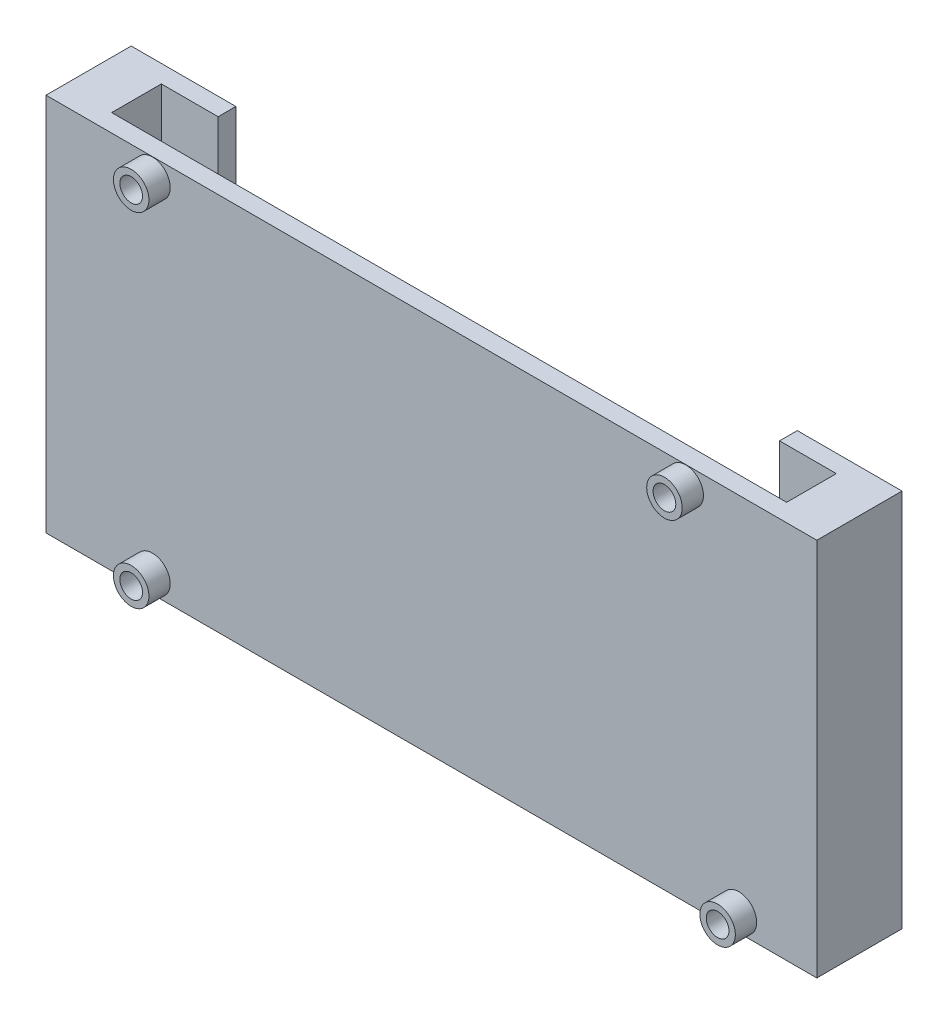
ISO-10303-21;
HEADER;
FILE_DESCRIPTION(('STEP AP214'),'2;1');
FILE_NAME('part.step','',(''),(''),'','','');
FILE_SCHEMA(('AUTOMOTIVE_DESIGN { 1 0 10303 214 1 1 1 1 }'));
ENDSEC;
DATA;
#1=APPLICATION_CONTEXT('core data for automotive mechanical design processes');
#2=APPLICATION_PROTOCOL_DEFINITION('international standard','automotive_design',2000,#1);
#3=PRODUCT_CONTEXT('',#1,'mechanical');
#4=PRODUCT('Part','Part','',(#3));
#5=PRODUCT_RELATED_PRODUCT_CATEGORY('part','',(#4));
#6=PRODUCT_DEFINITION_FORMATION('','',#4);
#7=PRODUCT_DEFINITION_CONTEXT('part definition',#1,'design');
#8=PRODUCT_DEFINITION('design','',#6,#7);
#9=PRODUCT_DEFINITION_SHAPE('','',#8);
#10=(LENGTH_UNIT() NAMED_UNIT(*) SI_UNIT(.MILLI.,.METRE.));
#11=(NAMED_UNIT(*) PLANE_ANGLE_UNIT() SI_UNIT($,.RADIAN.));
#12=(NAMED_UNIT(*) SI_UNIT($,.STERADIAN.) SOLID_ANGLE_UNIT());
#13=UNCERTAINTY_MEASURE_WITH_UNIT(LENGTH_MEASURE(1.E-05),#10,'distance_accuracy_value','');
#14=(GEOMETRIC_REPRESENTATION_CONTEXT(3) GLOBAL_UNCERTAINTY_ASSIGNED_CONTEXT((#13)) GLOBAL_UNIT_ASSIGNED_CONTEXT((#10,
#11,#12)) REPRESENTATION_CONTEXT('',''));
#15=CARTESIAN_POINT('',(0.,0.,0.));
#16=DIRECTION('',(0.,0.,1.));
#17=DIRECTION('',(1.,0.,0.));
#18=AXIS2_PLACEMENT_3D('',#15,#16,#17);
#19=CARTESIAN_POINT('',(-47.55,26.7081,-9.5));
#20=DIRECTION('',(-1.,0.,0.));
#21=DIRECTION('',(0.,-1.,0.));
#22=AXIS2_PLACEMENT_3D('',#19,#20,#21);
#23=PLANE('',#22);
#24=DIRECTION('',(0.,-1.,0.));
#25=VECTOR('',#24,1.);
#26=CARTESIAN_POINT('',(-47.55,26.7081,-7.));
#27=LINE('',#26,#25);
#28=CARTESIAN_POINT('',(-47.55,26.7081,-7.));
#29=VERTEX_POINT('',#28);
#30=CARTESIAN_POINT('',(-47.55,-26.7081,-7.00000000000001));
#31=VERTEX_POINT('',#30);
#32=EDGE_CURVE('E158',#29,#31,#27,.T.);
#33=ORIENTED_EDGE('',*,*,#32,.F.);
#34=DIRECTION('',(0.,0.,1.));
#35=VECTOR('',#34,1.);
#36=CARTESIAN_POINT('',(-47.55,26.7081,-9.5));
#37=LINE('',#36,#35);
#38=CARTESIAN_POINT('',(-47.55,26.7081,0.));
#39=VERTEX_POINT('',#38);
#40=EDGE_CURVE('E186',#29,#39,#37,.T.);
#41=ORIENTED_EDGE('',*,*,#40,.T.);
#42=DIRECTION('',(0.,-1.,0.));
#43=VECTOR('',#42,1.);
#44=CARTESIAN_POINT('',(-47.55,26.7081,0.));
#45=LINE('',#44,#43);
#46=CARTESIAN_POINT('',(-47.55,-26.7081,0.));
#47=VERTEX_POINT('',#46);
#48=EDGE_CURVE('E192',#39,#47,#45,.T.);
#49=ORIENTED_EDGE('',*,*,#48,.T.);
#50=DIRECTION('',(0.,0.,1.));
#51=VECTOR('',#50,1.);
#52=CARTESIAN_POINT('',(-47.55,-26.7081,-9.5));
#53=LINE('',#52,#51);
#54=EDGE_CURVE('E57',#31,#47,#53,.T.);
#55=ORIENTED_EDGE('',*,*,#54,.F.);
#56=EDGE_LOOP('',(#33,#41,#49,#55));
#57=FACE_BOUND('',#56,.T.);
#58=ADVANCED_FACE('F41',(#57),#23,.F.);
#59=CARTESIAN_POINT('',(47.55,26.7081,-9.5));
#60=DIRECTION('',(1.,0.,0.));
#61=DIRECTION('',(0.,1.,0.));
#62=AXIS2_PLACEMENT_3D('',#59,#60,#61);
#63=PLANE('',#62);
#64=DIRECTION('',(0.,1.,0.));
#65=VECTOR('',#64,1.);
#66=CARTESIAN_POINT('',(47.55,26.7081,-7.));
#67=LINE('',#66,#65);
#68=CARTESIAN_POINT('',(47.55,-26.7081,-6.99999999999999));
#69=VERTEX_POINT('',#68);
#70=CARTESIAN_POINT('',(47.55,26.7081,-7.));
#71=VERTEX_POINT('',#70);
#72=EDGE_CURVE('E175',#69,#71,#67,.T.);
#73=ORIENTED_EDGE('',*,*,#72,.F.);
#74=DIRECTION('',(0.,0.,1.));
#75=VECTOR('',#74,1.);
#76=CARTESIAN_POINT('',(47.55,-26.7081,-9.5));
#77=LINE('',#76,#75);
#78=CARTESIAN_POINT('',(47.55,-26.7081,0.));
#79=VERTEX_POINT('',#78);
#80=EDGE_CURVE('E63',#69,#79,#77,.T.);
#81=ORIENTED_EDGE('',*,*,#80,.T.);
#82=DIRECTION('',(0.,1.,0.));
#83=VECTOR('',#82,1.);
#84=CARTESIAN_POINT('',(47.55,26.7081,0.));
#85=LINE('',#84,#83);
#86=CARTESIAN_POINT('',(47.55,26.7081,0.));
#87=VERTEX_POINT('',#86);
#88=EDGE_CURVE('E193',#79,#87,#85,.T.);
#89=ORIENTED_EDGE('',*,*,#88,.T.);
#90=DIRECTION('',(0.,0.,1.));
#91=VECTOR('',#90,1.);
#92=CARTESIAN_POINT('',(47.55,26.7081,-9.5));
#93=LINE('',#92,#91);
#94=EDGE_CURVE('E202',#71,#87,#93,.T.);
#95=ORIENTED_EDGE('',*,*,#94,.F.);
#96=EDGE_LOOP('',(#73,#81,#89,#95));
#97=FACE_BOUND('',#96,.T.);
#98=ADVANCED_FACE('F308',(#97),#63,.F.);
#99=CARTESIAN_POINT('',(0.,0.,0.));
#100=DIRECTION('',(0.,0.,-1.));
#101=DIRECTION('',(-1.,0.,0.));
#102=AXIS2_PLACEMENT_3D('',#99,#100,#101);
#103=PLANE('',#102);
#104=CARTESIAN_POINT('',(-39.3,24.1681,0.));
#105=DIRECTION('',(0.,0.,1.));
#106=DIRECTION('',(1.,0.,0.));
#107=AXIS2_PLACEMENT_3D('',#104,#105,#106);
#108=CIRCLE('',#107,1.6);
#109=CARTESIAN_POINT('',(-37.7,24.1681,0.));
#110=VERTEX_POINT('',#109);
#111=EDGE_CURVE('E212',#110,#110,#108,.T.);
#112=ORIENTED_EDGE('',*,*,#111,.T.);
#113=EDGE_LOOP('',(#112));
#114=FACE_BOUND('',#113,.T.);
#115=CARTESIAN_POINT('',(35.83,24.1681,0.));
#116=DIRECTION('',(0.,0.,1.));
#117=DIRECTION('',(1.,0.,0.));
#118=AXIS2_PLACEMENT_3D('',#115,#116,#117);
#119=CIRCLE('',#118,1.6);
#120=CARTESIAN_POINT('',(37.43,24.1681,0.));
#121=VERTEX_POINT('',#120);
#122=EDGE_CURVE('E219',#121,#121,#119,.T.);
#123=ORIENTED_EDGE('',*,*,#122,.T.);
#124=EDGE_LOOP('',(#123));
#125=FACE_BOUND('',#124,.T.);
#126=CARTESIAN_POINT('',(43.32,-24.16810902,0.));
#127=DIRECTION('',(0.,0.,1.));
#128=DIRECTION('',(1.,0.,0.));
#129=AXIS2_PLACEMENT_3D('',#126,#127,#128);
#130=CIRCLE('',#129,1.6);
#131=CARTESIAN_POINT('',(44.92,-24.16810902,0.));
#132=VERTEX_POINT('',#131);
#133=EDGE_CURVE('E223',#132,#132,#130,.T.);
#134=ORIENTED_EDGE('',*,*,#133,.T.);
#135=EDGE_LOOP('',(#134));
#136=FACE_BOUND('',#135,.T.);
#137=CARTESIAN_POINT('',(-39.3,-24.16810902,0.));
#138=DIRECTION('',(0.,0.,1.));
#139=DIRECTION('',(1.,0.,0.));
#140=AXIS2_PLACEMENT_3D('',#137,#138,#139);
#141=CIRCLE('',#140,1.6);
#142=CARTESIAN_POINT('',(-37.7,-24.16810902,0.));
#143=VERTEX_POINT('',#142);
#144=EDGE_CURVE('E229',#143,#143,#141,.T.);
#145=ORIENTED_EDGE('',*,*,#144,.T.);
#146=EDGE_LOOP('',(#145));
#147=FACE_BOUND('',#146,.T.);
#148=DIRECTION('',(1.,0.,0.));
#149=VECTOR('',#148,1.);
#150=CARTESIAN_POINT('',(-54.3,-26.7081,0.));
#151=LINE('',#150,#149);
#152=EDGE_CURVE('E249',#47,#79,#151,.T.);
#153=ORIENTED_EDGE('',*,*,#152,.F.);
#154=ORIENTED_EDGE('',*,*,#48,.F.);
#155=DIRECTION('',(-1.,0.,0.));
#156=VECTOR('',#155,1.);
#157=CARTESIAN_POINT('',(-54.3,26.7081,0.));
#158=LINE('',#157,#156);
#159=EDGE_CURVE('E244',#87,#39,#158,.T.);
#160=ORIENTED_EDGE('',*,*,#159,.F.);
#161=ORIENTED_EDGE('',*,*,#88,.F.);
#162=EDGE_LOOP('',(#153,#154,#160,#161));
#163=FACE_BOUND('',#162,.T.);
#164=ADVANCED_FACE('F315',(#114,#125,#136,#147,#163),#103,.T.);
#165=CARTESIAN_POINT('',(54.3,-26.7081,2.5));
#166=DIRECTION('',(-1.,0.,0.));
#167=DIRECTION('',(0.,0.,1.));
#168=AXIS2_PLACEMENT_3D('',#165,#166,#167);
#169=PLANE('',#168);
#170=DIRECTION('',(0.,0.,-1.));
#171=VECTOR('',#170,1.);
#172=CARTESIAN_POINT('',(54.3,-26.7081,2.5));
#173=LINE('',#172,#171);
#174=CARTESIAN_POINT('',(54.3,-26.7081,2.5));
#175=VERTEX_POINT('',#174);
#176=CARTESIAN_POINT('',(54.3,-26.7081,-9.5));
#177=VERTEX_POINT('',#176);
#178=EDGE_CURVE('E256',#175,#177,#173,.T.);
#179=ORIENTED_EDGE('',*,*,#178,.T.);
#180=DIRECTION('',(0.,-1.,0.));
#181=VECTOR('',#180,1.);
#182=CARTESIAN_POINT('',(54.3,26.7081,-9.5));
#183=LINE('',#182,#181);
#184=CARTESIAN_POINT('',(54.3,26.7081,-9.5));
#185=VERTEX_POINT('',#184);
#186=EDGE_CURVE('E200',#185,#177,#183,.T.);
#187=ORIENTED_EDGE('',*,*,#186,.F.);
#188=DIRECTION('',(0.,0.,-1.));
#189=VECTOR('',#188,1.);
#190=CARTESIAN_POINT('',(54.3,26.7081,2.5));
#191=LINE('',#190,#189);
#192=CARTESIAN_POINT('',(54.3,26.7081,2.5));
#193=VERTEX_POINT('',#192);
#194=EDGE_CURVE('E263',#193,#185,#191,.T.);
#195=ORIENTED_EDGE('',*,*,#194,.F.);
#196=DIRECTION('',(0.,1.,0.));
#197=VECTOR('',#196,1.);
#198=CARTESIAN_POINT('',(54.3,-26.7081,2.5));
#199=LINE('',#198,#197);
#200=EDGE_CURVE('E246',#175,#193,#199,.T.);
#201=ORIENTED_EDGE('',*,*,#200,.F.);
#202=EDGE_LOOP('',(#179,#187,#195,#201));
#203=FACE_BOUND('',#202,.T.);
#204=ADVANCED_FACE('F43',(#203),#169,.F.);
#205=CARTESIAN_POINT('',(-54.3,26.7081,2.5));
#206=DIRECTION('',(0.,-1.,0.));
#207=DIRECTION('',(0.,0.,-1.));
#208=AXIS2_PLACEMENT_3D('',#205,#206,#207);
#209=PLANE('',#208);
#210=ORIENTED_EDGE('',*,*,#194,.T.);
#211=DIRECTION('',(1.,0.,0.));
#212=VECTOR('',#211,1.);
#213=CARTESIAN_POINT('',(54.3,26.7081,-9.5));
#214=LINE('',#213,#212);
#215=CARTESIAN_POINT('',(39.55,26.7081,-9.5));
#216=VERTEX_POINT('',#215);
#217=EDGE_CURVE('E201',#216,#185,#214,.T.);
#218=ORIENTED_EDGE('',*,*,#217,.F.);
#219=DIRECTION('',(0.,0.,-1.));
#220=VECTOR('',#219,1.);
#221=CARTESIAN_POINT('',(39.55,26.7081,-9.5));
#222=LINE('',#221,#220);
#223=CARTESIAN_POINT('',(39.55,26.7081,-7.));
#224=VERTEX_POINT('',#223);
#225=EDGE_CURVE('E179',#224,#216,#222,.T.);
#226=ORIENTED_EDGE('',*,*,#225,.F.);
#227=DIRECTION('',(1.,0.,0.));
#228=VECTOR('',#227,1.);
#229=CARTESIAN_POINT('',(39.55,26.7081,-7.));
#230=LINE('',#229,#228);
#231=EDGE_CURVE('E182',#224,#71,#230,.T.);
#232=ORIENTED_EDGE('',*,*,#231,.T.);
#233=ORIENTED_EDGE('',*,*,#94,.T.);
#234=ORIENTED_EDGE('',*,*,#159,.T.);
#235=ORIENTED_EDGE('',*,*,#40,.F.);
#236=DIRECTION('',(-1.,0.,0.));
#237=VECTOR('',#236,1.);
#238=CARTESIAN_POINT('',(-39.55,26.7081,-7.));
#239=LINE('',#238,#237);
#240=CARTESIAN_POINT('',(-39.55,26.7081,-7.));
#241=VERTEX_POINT('',#240);
#242=EDGE_CURVE('E150',#241,#29,#239,.T.);
#243=ORIENTED_EDGE('',*,*,#242,.F.);
#244=DIRECTION('',(0.,0.,1.));
#245=VECTOR('',#244,1.);
#246=CARTESIAN_POINT('',(-39.55,26.7081,-9.5));
#247=LINE('',#246,#245);
#248=CARTESIAN_POINT('',(-39.55,26.7081,-9.5));
#249=VERTEX_POINT('',#248);
#250=EDGE_CURVE('E147',#249,#241,#247,.T.);
#251=ORIENTED_EDGE('',*,*,#250,.F.);
#252=DIRECTION('',(1.,0.,0.));
#253=VECTOR('',#252,1.);
#254=CARTESIAN_POINT('',(-54.3,26.7081,-9.5));
#255=LINE('',#254,#253);
#256=CARTESIAN_POINT('',(-54.3,26.7081,-9.5));
#257=VERTEX_POINT('',#256);
#258=EDGE_CURVE('E131',#257,#249,#255,.T.);
#259=ORIENTED_EDGE('',*,*,#258,.F.);
#260=DIRECTION('',(0.,0.,-1.));
#261=VECTOR('',#260,1.);
#262=CARTESIAN_POINT('',(-54.3,26.7081,2.5));
#263=LINE('',#262,#261);
#264=CARTESIAN_POINT('',(-54.3,26.7081,2.5));
#265=VERTEX_POINT('',#264);
#266=EDGE_CURVE('E264',#265,#257,#263,.T.);
#267=ORIENTED_EDGE('',*,*,#266,.F.);
#268=DIRECTION('',(-1.,0.,0.));
#269=VECTOR('',#268,1.);
#270=CARTESIAN_POINT('',(-54.3,26.7081,2.5));
#271=LINE('',#270,#269);
#272=EDGE_CURVE('E248',#193,#265,#271,.T.);
#273=ORIENTED_EDGE('',*,*,#272,.F.);
#274=EDGE_LOOP('',(#210,#218,#226,#232,#233,#234,#235,#243,#251,#259,#267,#273));
#275=FACE_BOUND('',#274,.T.);
#276=ADVANCED_FACE('F149',(#275),#209,.F.);
#277=CARTESIAN_POINT('',(-54.3,-26.7081,2.5));
#278=DIRECTION('',(1.,0.,0.));
#279=DIRECTION('',(0.,0.,-1.));
#280=AXIS2_PLACEMENT_3D('',#277,#278,#279);
#281=PLANE('',#280);
#282=ORIENTED_EDGE('',*,*,#266,.T.);
#283=DIRECTION('',(0.,1.,0.));
#284=VECTOR('',#283,1.);
#285=CARTESIAN_POINT('',(-54.3,26.7081,-9.5));
#286=LINE('',#285,#284);
#287=CARTESIAN_POINT('',(-54.3,-26.7081,-9.5));
#288=VERTEX_POINT('',#287);
#289=EDGE_CURVE('E142',#288,#257,#286,.T.);
#290=ORIENTED_EDGE('',*,*,#289,.F.);
#291=DIRECTION('',(0.,0.,-1.));
#292=VECTOR('',#291,1.);
#293=CARTESIAN_POINT('',(-54.3,-26.7081,2.5));
#294=LINE('',#293,#292);
#295=CARTESIAN_POINT('',(-54.3,-26.7081,2.5));
#296=VERTEX_POINT('',#295);
#297=EDGE_CURVE('E262',#296,#288,#294,.T.);
#298=ORIENTED_EDGE('',*,*,#297,.F.);
#299=DIRECTION('',(0.,-1.,0.));
#300=VECTOR('',#299,1.);
#301=CARTESIAN_POINT('',(-54.3,-26.7081,2.5));
#302=LINE('',#301,#300);
#303=EDGE_CURVE('E255',#265,#296,#302,.T.);
#304=ORIENTED_EDGE('',*,*,#303,.F.);
#305=EDGE_LOOP('',(#282,#290,#298,#304));
#306=FACE_BOUND('',#305,.T.);
#307=ADVANCED_FACE('F321',(#306),#281,.F.);
#308=CARTESIAN_POINT('',(-54.3,-26.7081,2.5));
#309=DIRECTION('',(0.,1.,0.));
#310=DIRECTION('',(0.,0.,1.));
#311=AXIS2_PLACEMENT_3D('',#308,#309,#310);
#312=PLANE('',#311);
#313=CARTESIAN_POINT('',(-50.925,-26.7081,-3.5));
#314=DIRECTION('',(0.,-1.,0.));
#315=DIRECTION('',(0.,0.,-1.));
#316=AXIS2_PLACEMENT_3D('',#313,#314,#315);
#317=CIRCLE('',#316,3.15);
#318=CARTESIAN_POINT('',(-50.925,-26.7081,-6.65));
#319=VERTEX_POINT('',#318);
#320=EDGE_CURVE('E518',#319,#319,#317,.T.);
#321=ORIENTED_EDGE('',*,*,#320,.F.);
#322=EDGE_LOOP('',(#321));
#323=FACE_BOUND('',#322,.T.);
#324=CARTESIAN_POINT('',(50.925,-26.7081,-3.5));
#325=DIRECTION('',(0.,-1.,0.));
#326=DIRECTION('',(0.,0.,-1.));
#327=AXIS2_PLACEMENT_3D('',#324,#325,#326);
#328=CIRCLE('',#327,3.15);
#329=CARTESIAN_POINT('',(50.925,-26.7081,-6.65));
#330=VERTEX_POINT('',#329);
#331=EDGE_CURVE('E525',#330,#330,#328,.T.);
#332=ORIENTED_EDGE('',*,*,#331,.F.);
#333=EDGE_LOOP('',(#332));
#334=FACE_BOUND('',#333,.T.);
#335=ORIENTED_EDGE('',*,*,#297,.T.);
#336=DIRECTION('',(-1.,0.,0.));
#337=VECTOR('',#336,1.);
#338=CARTESIAN_POINT('',(-54.3,-26.7081,-9.5));
#339=LINE('',#338,#337);
#340=CARTESIAN_POINT('',(-39.55,-26.7081,-9.50000000000001));
#341=VERTEX_POINT('',#340);
#342=EDGE_CURVE('E144',#341,#288,#339,.T.);
#343=ORIENTED_EDGE('',*,*,#342,.F.);
#344=DIRECTION('',(0.,0.,-1.));
#345=VECTOR('',#344,1.);
#346=CARTESIAN_POINT('',(-39.55,-26.7081,-9.50000000000001));
#347=LINE('',#346,#345);
#348=CARTESIAN_POINT('',(-39.55,-26.7081,-7.00000000000001));
#349=VERTEX_POINT('',#348);
#350=EDGE_CURVE('E160',#349,#341,#347,.T.);
#351=ORIENTED_EDGE('',*,*,#350,.F.);
#352=DIRECTION('',(-1.,0.,0.));
#353=VECTOR('',#352,1.);
#354=CARTESIAN_POINT('',(-39.55,-26.7081,-7.00000000000001));
#355=LINE('',#354,#353);
#356=EDGE_CURVE('E166',#349,#31,#355,.T.);
#357=ORIENTED_EDGE('',*,*,#356,.T.);
#358=ORIENTED_EDGE('',*,*,#54,.T.);
#359=ORIENTED_EDGE('',*,*,#152,.T.);
#360=ORIENTED_EDGE('',*,*,#80,.F.);
#361=DIRECTION('',(1.,0.,0.));
#362=VECTOR('',#361,1.);
#363=CARTESIAN_POINT('',(39.55,-26.7081,-6.99999999999999));
#364=LINE('',#363,#362);
#365=CARTESIAN_POINT('',(39.55,-26.7081,-6.99999999999999));
#366=VERTEX_POINT('',#365);
#367=EDGE_CURVE('E190',#366,#69,#364,.T.);
#368=ORIENTED_EDGE('',*,*,#367,.F.);
#369=DIRECTION('',(0.,0.,1.));
#370=VECTOR('',#369,1.);
#371=CARTESIAN_POINT('',(39.55,-26.7081,-9.49999999999999));
#372=LINE('',#371,#370);
#373=CARTESIAN_POINT('',(39.55,-26.7081,-9.49999999999999));
#374=VERTEX_POINT('',#373);
#375=EDGE_CURVE('E176',#374,#366,#372,.T.);
#376=ORIENTED_EDGE('',*,*,#375,.F.);
#377=DIRECTION('',(-1.,0.,0.));
#378=VECTOR('',#377,1.);
#379=CARTESIAN_POINT('',(54.3,-26.7081,-9.5));
#380=LINE('',#379,#378);
#381=EDGE_CURVE('E198',#177,#374,#380,.T.);
#382=ORIENTED_EDGE('',*,*,#381,.F.);
#383=ORIENTED_EDGE('',*,*,#178,.F.);
#384=DIRECTION('',(1.,0.,0.));
#385=VECTOR('',#384,1.);
#386=CARTESIAN_POINT('',(-54.3,-26.7081,2.5));
#387=LINE('',#386,#385);
#388=EDGE_CURVE('E251',#296,#175,#387,.T.);
#389=ORIENTED_EDGE('',*,*,#388,.F.);
#390=EDGE_LOOP('',(#335,#343,#351,#357,#358,#359,#360,#368,#376,#382,#383,#389));
#391=FACE_BOUND('',#390,.T.);
#392=ADVANCED_FACE('F282',(#323,#334,#391),#312,.F.);
#393=CARTESIAN_POINT('',(0.,0.,2.5));
#394=DIRECTION('',(0.,0.,-1.));
#395=DIRECTION('',(-1.,0.,0.));
#396=AXIS2_PLACEMENT_3D('',#393,#394,#395);
#397=PLANE('',#396);
#398=CARTESIAN_POINT('',(-39.3,-24.16810902,2.5));
#399=DIRECTION('',(0.,0.,-1.));
#400=DIRECTION('',(-1.,0.,0.));
#401=AXIS2_PLACEMENT_3D('',#398,#399,#400);
#402=CIRCLE('',#401,2.5);
#403=CARTESIAN_POINT('',(-41.8,-24.16810902,2.5));
#404=VERTEX_POINT('',#403);
#405=EDGE_CURVE('E11',#404,#404,#402,.F.);
#406=ORIENTED_EDGE('',*,*,#405,.F.);
#407=EDGE_LOOP('',(#406));
#408=FACE_BOUND('',#407,.T.);
#409=CARTESIAN_POINT('',(43.32,-24.16810902,2.5));
#410=DIRECTION('',(0.,0.,-1.));
#411=DIRECTION('',(-1.,0.,0.));
#412=AXIS2_PLACEMENT_3D('',#409,#410,#411);
#413=CIRCLE('',#412,2.5);
#414=CARTESIAN_POINT('',(40.82,-24.16810902,2.5));
#415=VERTEX_POINT('',#414);
#416=EDGE_CURVE('E47',#415,#415,#413,.F.);
#417=ORIENTED_EDGE('',*,*,#416,.F.);
#418=EDGE_LOOP('',(#417));
#419=FACE_BOUND('',#418,.T.);
#420=CARTESIAN_POINT('',(35.83,24.1681,2.5));
#421=DIRECTION('',(0.,0.,-1.));
#422=DIRECTION('',(-1.,0.,0.));
#423=AXIS2_PLACEMENT_3D('',#420,#421,#422);
#424=CIRCLE('',#423,2.5);
#425=CARTESIAN_POINT('',(33.33,24.1681,2.5));
#426=VERTEX_POINT('',#425);
#427=EDGE_CURVE('E267',#426,#426,#424,.F.);
#428=ORIENTED_EDGE('',*,*,#427,.F.);
#429=EDGE_LOOP('',(#428));
#430=FACE_BOUND('',#429,.T.);
#431=CARTESIAN_POINT('',(-39.3,24.1681,2.5));
#432=DIRECTION('',(0.,0.,-1.));
#433=DIRECTION('',(-1.,0.,0.));
#434=AXIS2_PLACEMENT_3D('',#431,#432,#433);
#435=CIRCLE('',#434,2.5);
#436=CARTESIAN_POINT('',(-41.8,24.1681,2.5));
#437=VERTEX_POINT('',#436);
#438=EDGE_CURVE('E266',#437,#437,#435,.F.);
#439=ORIENTED_EDGE('',*,*,#438,.F.);
#440=EDGE_LOOP('',(#439));
#441=FACE_BOUND('',#440,.T.);
#442=ORIENTED_EDGE('',*,*,#200,.T.);
#443=ORIENTED_EDGE('',*,*,#272,.T.);
#444=ORIENTED_EDGE('',*,*,#303,.T.);
#445=ORIENTED_EDGE('',*,*,#388,.T.);
#446=EDGE_LOOP('',(#442,#443,#444,#445));
#447=FACE_BOUND('',#446,.T.);
#448=ADVANCED_FACE('F277',(#408,#419,#430,#441,#447),#397,.F.);
#449=CARTESIAN_POINT('',(-39.3,24.1681,5.5));
#450=DIRECTION('',(0.,0.,-1.));
#451=DIRECTION('',(-1.,0.,0.));
#452=AXIS2_PLACEMENT_3D('',#449,#450,#451);
#453=CYLINDRICAL_SURFACE('',#452,2.5);
#454=CARTESIAN_POINT('',(-39.3,24.1681,5.5));
#455=DIRECTION('',(0.,0.,1.));
#456=DIRECTION('',(1.,0.,0.));
#457=AXIS2_PLACEMENT_3D('',#454,#455,#456);
#458=CIRCLE('',#457,2.5);
#459=CARTESIAN_POINT('',(-36.8,24.1681,5.5));
#460=VERTEX_POINT('',#459);
#461=EDGE_CURVE('E245',#460,#460,#458,.T.);
#462=ORIENTED_EDGE('',*,*,#461,.F.);
#463=EDGE_LOOP('',(#462));
#464=FACE_BOUND('',#463,.T.);
#465=ORIENTED_EDGE('',*,*,#438,.T.);
#466=EDGE_LOOP('',(#465));
#467=FACE_BOUND('',#466,.T.);
#468=ADVANCED_FACE('F280',(#464,#467),#453,.T.);
#469=CARTESIAN_POINT('',(-39.3,24.1681,5.5));
#470=DIRECTION('',(0.,0.,1.));
#471=DIRECTION('',(1.,0.,0.));
#472=AXIS2_PLACEMENT_3D('',#469,#470,#471);
#473=PLANE('',#472);
#474=CARTESIAN_POINT('',(-39.3,24.1681,5.5));
#475=DIRECTION('',(0.,0.,1.));
#476=DIRECTION('',(1.,0.,0.));
#477=AXIS2_PLACEMENT_3D('',#474,#475,#476);
#478=CIRCLE('',#477,1.6);
#479=CARTESIAN_POINT('',(-37.7,24.1681,5.5));
#480=VERTEX_POINT('',#479);
#481=EDGE_CURVE('E209',#480,#480,#478,.T.);
#482=ORIENTED_EDGE('',*,*,#481,.F.);
#483=EDGE_LOOP('',(#482));
#484=FACE_BOUND('',#483,.T.);
#485=ORIENTED_EDGE('',*,*,#461,.T.);
#486=EDGE_LOOP('',(#485));
#487=FACE_BOUND('',#486,.T.);
#488=ADVANCED_FACE('F380',(#484,#487),#473,.T.);
#489=CARTESIAN_POINT('',(35.83,24.1681,5.5));
#490=DIRECTION('',(0.,0.,-1.));
#491=DIRECTION('',(-1.,0.,0.));
#492=AXIS2_PLACEMENT_3D('',#489,#490,#491);
#493=CYLINDRICAL_SURFACE('',#492,2.5);
#494=CARTESIAN_POINT('',(35.83,24.1681,5.5));
#495=DIRECTION('',(0.,0.,1.));
#496=DIRECTION('',(1.,0.,0.));
#497=AXIS2_PLACEMENT_3D('',#494,#495,#496);
#498=CIRCLE('',#497,2.5);
#499=CARTESIAN_POINT('',(38.33,24.1681,5.5));
#500=VERTEX_POINT('',#499);
#501=EDGE_CURVE('E237',#500,#500,#498,.T.);
#502=ORIENTED_EDGE('',*,*,#501,.F.);
#503=EDGE_LOOP('',(#502));
#504=FACE_BOUND('',#503,.T.);
#505=ORIENTED_EDGE('',*,*,#427,.T.);
#506=EDGE_LOOP('',(#505));
#507=FACE_BOUND('',#506,.T.);
#508=ADVANCED_FACE('F372',(#504,#507),#493,.T.);
#509=CARTESIAN_POINT('',(35.83,24.1681,5.5));
#510=DIRECTION('',(0.,0.,1.));
#511=DIRECTION('',(1.,0.,0.));
#512=AXIS2_PLACEMENT_3D('',#509,#510,#511);
#513=PLANE('',#512);
#514=CARTESIAN_POINT('',(35.83,24.1681,5.5));
#515=DIRECTION('',(0.,0.,1.));
#516=DIRECTION('',(1.,0.,0.));
#517=AXIS2_PLACEMENT_3D('',#514,#515,#516);
#518=CIRCLE('',#517,1.6);
#519=CARTESIAN_POINT('',(37.43,24.1681,5.5));
#520=VERTEX_POINT('',#519);
#521=EDGE_CURVE('E215',#520,#520,#518,.T.);
#522=ORIENTED_EDGE('',*,*,#521,.F.);
#523=EDGE_LOOP('',(#522));
#524=FACE_BOUND('',#523,.T.);
#525=ORIENTED_EDGE('',*,*,#501,.T.);
#526=EDGE_LOOP('',(#525));
#527=FACE_BOUND('',#526,.T.);
#528=ADVANCED_FACE('F367',(#524,#527),#513,.T.);
#529=CARTESIAN_POINT('',(43.32,-24.16810902,5.5));
#530=DIRECTION('',(0.,0.,-1.));
#531=DIRECTION('',(-1.,0.,0.));
#532=AXIS2_PLACEMENT_3D('',#529,#530,#531);
#533=CYLINDRICAL_SURFACE('',#532,2.5);
#534=CARTESIAN_POINT('',(43.32,-24.16810902,5.5));
#535=DIRECTION('',(0.,0.,1.));
#536=DIRECTION('',(1.,0.,0.));
#537=AXIS2_PLACEMENT_3D('',#534,#535,#536);
#538=CIRCLE('',#537,2.5);
#539=CARTESIAN_POINT('',(45.82,-24.16810902,5.5));
#540=VERTEX_POINT('',#539);
#541=EDGE_CURVE('E236',#540,#540,#538,.T.);
#542=ORIENTED_EDGE('',*,*,#541,.F.);
#543=EDGE_LOOP('',(#542));
#544=FACE_BOUND('',#543,.T.);
#545=ORIENTED_EDGE('',*,*,#416,.T.);
#546=EDGE_LOOP('',(#545));
#547=FACE_BOUND('',#546,.T.);
#548=ADVANCED_FACE('F273',(#544,#547),#533,.T.);
#549=CARTESIAN_POINT('',(43.32,-24.16810902,5.5));
#550=DIRECTION('',(0.,0.,1.));
#551=DIRECTION('',(1.,0.,0.));
#552=AXIS2_PLACEMENT_3D('',#549,#550,#551);
#553=PLANE('',#552);
#554=CARTESIAN_POINT('',(43.32,-24.16810902,5.5));
#555=DIRECTION('',(0.,0.,1.));
#556=DIRECTION('',(1.,0.,0.));
#557=AXIS2_PLACEMENT_3D('',#554,#555,#556);
#558=CIRCLE('',#557,1.6);
#559=CARTESIAN_POINT('',(44.92,-24.16810902,5.5));
#560=VERTEX_POINT('',#559);
#561=EDGE_CURVE('E224',#560,#560,#558,.T.);
#562=ORIENTED_EDGE('',*,*,#561,.F.);
#563=EDGE_LOOP('',(#562));
#564=FACE_BOUND('',#563,.T.);
#565=ORIENTED_EDGE('',*,*,#541,.T.);
#566=EDGE_LOOP('',(#565));
#567=FACE_BOUND('',#566,.T.);
#568=ADVANCED_FACE('F365',(#564,#567),#553,.T.);
#569=CARTESIAN_POINT('',(-39.3,-24.16810902,5.5));
#570=DIRECTION('',(0.,0.,-1.));
#571=DIRECTION('',(-1.,0.,0.));
#572=AXIS2_PLACEMENT_3D('',#569,#570,#571);
#573=CYLINDRICAL_SURFACE('',#572,2.5);
#574=CARTESIAN_POINT('',(-39.3,-24.16810902,5.5));
#575=DIRECTION('',(0.,0.,1.));
#576=DIRECTION('',(1.,0.,0.));
#577=AXIS2_PLACEMENT_3D('',#574,#575,#576);
#578=CIRCLE('',#577,2.5);
#579=CARTESIAN_POINT('',(-36.8,-24.16810902,5.5));
#580=VERTEX_POINT('',#579);
#581=EDGE_CURVE('E231',#580,#580,#578,.T.);
#582=ORIENTED_EDGE('',*,*,#581,.F.);
#583=EDGE_LOOP('',(#582));
#584=FACE_BOUND('',#583,.T.);
#585=ORIENTED_EDGE('',*,*,#405,.T.);
#586=EDGE_LOOP('',(#585));
#587=FACE_BOUND('',#586,.T.);
#588=ADVANCED_FACE('F360',(#584,#587),#573,.T.);
#589=CARTESIAN_POINT('',(-39.3,-24.16810902,5.5));
#590=DIRECTION('',(0.,0.,1.));
#591=DIRECTION('',(1.,0.,0.));
#592=AXIS2_PLACEMENT_3D('',#589,#590,#591);
#593=PLANE('',#592);
#594=CARTESIAN_POINT('',(-39.3,-24.16810902,5.5));
#595=DIRECTION('',(0.,0.,1.));
#596=DIRECTION('',(1.,0.,0.));
#597=AXIS2_PLACEMENT_3D('',#594,#595,#596);
#598=CIRCLE('',#597,1.6);
#599=CARTESIAN_POINT('',(-37.7,-24.16810902,5.5));
#600=VERTEX_POINT('',#599);
#601=EDGE_CURVE('E227',#600,#600,#598,.T.);
#602=ORIENTED_EDGE('',*,*,#601,.F.);
#603=EDGE_LOOP('',(#602));
#604=FACE_BOUND('',#603,.T.);
#605=ORIENTED_EDGE('',*,*,#581,.T.);
#606=EDGE_LOOP('',(#605));
#607=FACE_BOUND('',#606,.T.);
#608=ADVANCED_FACE('F357',(#604,#607),#593,.T.);
#609=CARTESIAN_POINT('',(-39.3,-24.16810902,5.5));
#610=DIRECTION('',(0.,0.,1.));
#611=DIRECTION('',(1.,0.,0.));
#612=AXIS2_PLACEMENT_3D('',#609,#610,#611);
#613=CYLINDRICAL_SURFACE('',#612,1.6);
#614=ORIENTED_EDGE('',*,*,#144,.F.);
#615=EDGE_LOOP('',(#614));
#616=FACE_BOUND('',#615,.T.);
#617=ORIENTED_EDGE('',*,*,#601,.T.);
#618=EDGE_LOOP('',(#617));
#619=FACE_BOUND('',#618,.T.);
#620=ADVANCED_FACE('F355',(#616,#619),#613,.F.);
#621=CARTESIAN_POINT('',(43.32,-24.16810902,5.5));
#622=DIRECTION('',(0.,0.,1.));
#623=DIRECTION('',(1.,0.,0.));
#624=AXIS2_PLACEMENT_3D('',#621,#622,#623);
#625=CYLINDRICAL_SURFACE('',#624,1.6);
#626=ORIENTED_EDGE('',*,*,#133,.F.);
#627=EDGE_LOOP('',(#626));
#628=FACE_BOUND('',#627,.T.);
#629=ORIENTED_EDGE('',*,*,#561,.T.);
#630=EDGE_LOOP('',(#629));
#631=FACE_BOUND('',#630,.T.);
#632=ADVANCED_FACE('F346',(#628,#631),#625,.F.);
#633=CARTESIAN_POINT('',(35.83,24.1681,5.5));
#634=DIRECTION('',(0.,0.,1.));
#635=DIRECTION('',(1.,0.,0.));
#636=AXIS2_PLACEMENT_3D('',#633,#634,#635);
#637=CYLINDRICAL_SURFACE('',#636,1.6);
#638=ORIENTED_EDGE('',*,*,#122,.F.);
#639=EDGE_LOOP('',(#638));
#640=FACE_BOUND('',#639,.T.);
#641=ORIENTED_EDGE('',*,*,#521,.T.);
#642=EDGE_LOOP('',(#641));
#643=FACE_BOUND('',#642,.T.);
#644=ADVANCED_FACE('F345',(#640,#643),#637,.F.);
#645=CARTESIAN_POINT('',(-39.3,24.1681,5.5));
#646=DIRECTION('',(0.,0.,1.));
#647=DIRECTION('',(1.,0.,0.));
#648=AXIS2_PLACEMENT_3D('',#645,#646,#647);
#649=CYLINDRICAL_SURFACE('',#648,1.6);
#650=ORIENTED_EDGE('',*,*,#111,.F.);
#651=EDGE_LOOP('',(#650));
#652=FACE_BOUND('',#651,.T.);
#653=ORIENTED_EDGE('',*,*,#481,.T.);
#654=EDGE_LOOP('',(#653));
#655=FACE_BOUND('',#654,.T.);
#656=ADVANCED_FACE('F341',(#652,#655),#649,.F.);
#657=CARTESIAN_POINT('',(0.,0.,-9.5));
#658=DIRECTION('',(0.,0.,-1.));
#659=DIRECTION('',(-1.,0.,0.));
#660=AXIS2_PLACEMENT_3D('',#657,#658,#659);
#661=PLANE('',#660);
#662=ORIENTED_EDGE('',*,*,#186,.T.);
#663=ORIENTED_EDGE('',*,*,#381,.T.);
#664=DIRECTION('',(0.,-1.,0.));
#665=VECTOR('',#664,1.);
#666=CARTESIAN_POINT('',(39.55,26.7081,-9.5));
#667=LINE('',#666,#665);
#668=EDGE_CURVE('E173',#216,#374,#667,.T.);
#669=ORIENTED_EDGE('',*,*,#668,.F.);
#670=ORIENTED_EDGE('',*,*,#217,.T.);
#671=EDGE_LOOP('',(#662,#663,#669,#670));
#672=FACE_BOUND('',#671,.T.);
#673=ADVANCED_FACE('F300',(#672),#661,.T.);
#674=CARTESIAN_POINT('',(0.,0.,-9.5));
#675=DIRECTION('',(0.,0.,1.));
#676=DIRECTION('',(1.,0.,0.));
#677=AXIS2_PLACEMENT_3D('',#674,#675,#676);
#678=PLANE('',#677);
#679=ORIENTED_EDGE('',*,*,#289,.T.);
#680=ORIENTED_EDGE('',*,*,#258,.T.);
#681=DIRECTION('',(0.,1.,0.));
#682=VECTOR('',#681,1.);
#683=CARTESIAN_POINT('',(-39.55,26.7081,-9.5));
#684=LINE('',#683,#682);
#685=EDGE_CURVE('E138',#341,#249,#684,.T.);
#686=ORIENTED_EDGE('',*,*,#685,.F.);
#687=ORIENTED_EDGE('',*,*,#342,.T.);
#688=EDGE_LOOP('',(#679,#680,#686,#687));
#689=FACE_BOUND('',#688,.T.);
#690=ADVANCED_FACE('F139',(#689),#678,.F.);
#691=CARTESIAN_POINT('',(39.55,26.7081,-7.));
#692=DIRECTION('',(0.,0.,-1.));
#693=DIRECTION('',(0.,1.,0.));
#694=AXIS2_PLACEMENT_3D('',#691,#692,#693);
#695=PLANE('',#694);
#696=ORIENTED_EDGE('',*,*,#72,.T.);
#697=ORIENTED_EDGE('',*,*,#231,.F.);
#698=DIRECTION('',(0.,1.,0.));
#699=VECTOR('',#698,1.);
#700=CARTESIAN_POINT('',(39.55,26.7081,-7.));
#701=LINE('',#700,#699);
#702=EDGE_CURVE('E178',#366,#224,#701,.T.);
#703=ORIENTED_EDGE('',*,*,#702,.F.);
#704=ORIENTED_EDGE('',*,*,#367,.T.);
#705=EDGE_LOOP('',(#696,#697,#703,#704));
#706=FACE_BOUND('',#705,.T.);
#707=ADVANCED_FACE('F324',(#706),#695,.F.);
#708=CARTESIAN_POINT('',(39.55,0.,0.));
#709=DIRECTION('',(-1.,0.,0.));
#710=DIRECTION('',(0.,-1.,0.));
#711=AXIS2_PLACEMENT_3D('',#708,#709,#710);
#712=PLANE('',#711);
#713=ORIENTED_EDGE('',*,*,#668,.T.);
#714=ORIENTED_EDGE('',*,*,#375,.T.);
#715=ORIENTED_EDGE('',*,*,#702,.T.);
#716=ORIENTED_EDGE('',*,*,#225,.T.);
#717=EDGE_LOOP('',(#713,#714,#715,#716));
#718=FACE_BOUND('',#717,.T.);
#719=ADVANCED_FACE('F301',(#718),#712,.T.);
#720=CARTESIAN_POINT('',(-39.55,26.7081,-7.));
#721=DIRECTION('',(0.,0.,-1.));
#722=DIRECTION('',(0.,1.,0.));
#723=AXIS2_PLACEMENT_3D('',#720,#721,#722);
#724=PLANE('',#723);
#725=ORIENTED_EDGE('',*,*,#32,.T.);
#726=ORIENTED_EDGE('',*,*,#356,.F.);
#727=DIRECTION('',(0.,-1.,0.));
#728=VECTOR('',#727,1.);
#729=CARTESIAN_POINT('',(-39.55,26.7081,-7.));
#730=LINE('',#729,#728);
#731=EDGE_CURVE('E154',#241,#349,#730,.T.);
#732=ORIENTED_EDGE('',*,*,#731,.F.);
#733=ORIENTED_EDGE('',*,*,#242,.T.);
#734=EDGE_LOOP('',(#725,#726,#732,#733));
#735=FACE_BOUND('',#734,.T.);
#736=ADVANCED_FACE('F319',(#735),#724,.F.);
#737=CARTESIAN_POINT('',(-39.55,0.,0.));
#738=DIRECTION('',(-1.,0.,0.));
#739=DIRECTION('',(0.,-1.,0.));
#740=AXIS2_PLACEMENT_3D('',#737,#738,#739);
#741=PLANE('',#740);
#742=ORIENTED_EDGE('',*,*,#685,.T.);
#743=ORIENTED_EDGE('',*,*,#250,.T.);
#744=ORIENTED_EDGE('',*,*,#731,.T.);
#745=ORIENTED_EDGE('',*,*,#350,.T.);
#746=EDGE_LOOP('',(#742,#743,#744,#745));
#747=FACE_BOUND('',#746,.T.);
#748=ADVANCED_FACE('F159',(#747),#741,.F.);
#749=CARTESIAN_POINT('',(50.925,-24.0081,-3.5));
#750=DIRECTION('',(0.,-1.,0.));
#751=DIRECTION('',(0.,0.,-1.));
#752=AXIS2_PLACEMENT_3D('',#749,#750,#751);
#753=CYLINDRICAL_SURFACE('',#752,3.15);
#754=CARTESIAN_POINT('',(50.925,-24.0081,-3.5));
#755=DIRECTION('',(0.,-1.,0.));
#756=DIRECTION('',(0.,0.,-1.));
#757=AXIS2_PLACEMENT_3D('',#754,#755,#756);
#758=CIRCLE('',#757,3.15);
#759=CARTESIAN_POINT('',(50.925,-24.0081,-6.65));
#760=VERTEX_POINT('',#759);
#761=EDGE_CURVE('E165',#760,#760,#758,.T.);
#762=CARTESIAN_POINT('',(50.925,-24.0081,-6.65));
#763=CARTESIAN_POINT('',(50.925,-24.036225,-6.65));
#764=CARTESIAN_POINT('',(50.925,-24.06435,-6.65));
#765=CARTESIAN_POINT('',(50.925,-24.1206,-6.65));
#766=CARTESIAN_POINT('',(50.925,-24.148725,-6.65));
#767=CARTESIAN_POINT('',(50.925,-24.204975,-6.65));
#768=CARTESIAN_POINT('',(50.925,-24.2331,-6.65));
#769=CARTESIAN_POINT('',(50.925,-24.28935,-6.65));
#770=CARTESIAN_POINT('',(50.925,-24.317475,-6.65));
#771=CARTESIAN_POINT('',(50.925,-24.373725,-6.65));
#772=CARTESIAN_POINT('',(50.925,-24.40185,-6.65));
#773=CARTESIAN_POINT('',(50.925,-24.4581,-6.65));
#774=CARTESIAN_POINT('',(50.925,-24.486225,-6.65));
#775=CARTESIAN_POINT('',(50.925,-24.542475,-6.65));
#776=CARTESIAN_POINT('',(50.925,-24.5706,-6.65));
#777=CARTESIAN_POINT('',(50.925,-24.62685,-6.65));
#778=CARTESIAN_POINT('',(50.925,-24.654975,-6.65));
#779=CARTESIAN_POINT('',(50.925,-24.711225,-6.65));
#780=CARTESIAN_POINT('',(50.925,-24.73935,-6.65));
#781=CARTESIAN_POINT('',(50.925,-24.7956,-6.65));
#782=CARTESIAN_POINT('',(50.925,-24.823725,-6.65));
#783=CARTESIAN_POINT('',(50.925,-24.879975,-6.65));
#784=CARTESIAN_POINT('',(50.925,-24.9081,-6.65));
#785=CARTESIAN_POINT('',(50.925,-24.96435,-6.65));
#786=CARTESIAN_POINT('',(50.925,-24.992475,-6.65));
#787=CARTESIAN_POINT('',(50.925,-25.048725,-6.65));
#788=CARTESIAN_POINT('',(50.925,-25.07685,-6.65));
#789=CARTESIAN_POINT('',(50.925,-25.1331,-6.65));
#790=CARTESIAN_POINT('',(50.925,-25.161225,-6.65));
#791=CARTESIAN_POINT('',(50.925,-25.217475,-6.65));
#792=CARTESIAN_POINT('',(50.925,-25.2456,-6.65));
#793=CARTESIAN_POINT('',(50.925,-25.30185,-6.65));
#794=CARTESIAN_POINT('',(50.925,-25.329975,-6.65));
#795=CARTESIAN_POINT('',(50.925,-25.386225,-6.65));
#796=CARTESIAN_POINT('',(50.925,-25.41435,-6.65));
#797=CARTESIAN_POINT('',(50.925,-25.4706,-6.65));
#798=CARTESIAN_POINT('',(50.925,-25.498725,-6.65));
#799=CARTESIAN_POINT('',(50.925,-25.554975,-6.65));
#800=CARTESIAN_POINT('',(50.925,-25.5831,-6.65));
#801=CARTESIAN_POINT('',(50.925,-25.63935,-6.65));
#802=CARTESIAN_POINT('',(50.925,-25.667475,-6.65));
#803=CARTESIAN_POINT('',(50.925,-25.723725,-6.65));
#804=CARTESIAN_POINT('',(50.925,-25.75185,-6.65));
#805=CARTESIAN_POINT('',(50.925,-25.8081,-6.65));
#806=CARTESIAN_POINT('',(50.925,-25.836225,-6.65));
#807=CARTESIAN_POINT('',(50.925,-25.892475,-6.65));
#808=CARTESIAN_POINT('',(50.925,-25.9206,-6.65));
#809=CARTESIAN_POINT('',(50.925,-25.97685,-6.65));
#810=CARTESIAN_POINT('',(50.925,-26.004975,-6.65));
#811=CARTESIAN_POINT('',(50.925,-26.061225,-6.65));
#812=CARTESIAN_POINT('',(50.925,-26.08935,-6.65));
#813=CARTESIAN_POINT('',(50.925,-26.1456,-6.65));
#814=CARTESIAN_POINT('',(50.925,-26.173725,-6.65));
#815=CARTESIAN_POINT('',(50.925,-26.229975,-6.65));
#816=CARTESIAN_POINT('',(50.925,-26.2581,-6.65));
#817=CARTESIAN_POINT('',(50.925,-26.31435,-6.65));
#818=CARTESIAN_POINT('',(50.925,-26.342475,-6.65));
#819=CARTESIAN_POINT('',(50.925,-26.398725,-6.65));
#820=CARTESIAN_POINT('',(50.925,-26.42685,-6.65));
#821=CARTESIAN_POINT('',(50.925,-26.4831,-6.65));
#822=CARTESIAN_POINT('',(50.925,-26.511225,-6.65));
#823=CARTESIAN_POINT('',(50.925,-26.567475,-6.65));
#824=CARTESIAN_POINT('',(50.925,-26.5956,-6.65));
#825=CARTESIAN_POINT('',(50.925,-26.65185,-6.65));
#826=CARTESIAN_POINT('',(50.925,-26.679975,-6.65));
#827=CARTESIAN_POINT('',(50.925,-26.7081,-6.65));
#828=B_SPLINE_CURVE_WITH_KNOTS('',3,(#762,#763,#764,#765,#766,#767,#768,#769,#770,#771,#772,
#773,#774,#775,#776,#777,#778,#779,#780,#781,#782,#783,#784,#785,#786,#787,#788,#789,#790,#791,
#792,#793,#794,#795,#796,#797,#798,#799,#800,#801,#802,#803,#804,#805,#806,#807,#808,#809,#810,
#811,#812,#813,#814,#815,#816,#817,#818,#819,#820,#821,#822,#823,#824,#825,#826,#827),
.UNSPECIFIED.,.F.,.F.,(4,2,2,2,2,2,2,2,2,2,2,2,2,2,2,2,2,2,2,2,2,2,2,2,2,2,2,2,2,2,2,2,4),(0.,
0.0843749999999976,0.168749999999999,0.253125,0.337499999999998,0.421874999999999,0.50625,
0.590624999999997,0.674999999999998,0.759375,0.843749999999997,0.928124999999998,1.0125,
1.096875,1.18125,1.265625,1.35,1.434375,1.51875,1.603125,1.6875,1.771875,1.85625,1.940625,2.025,
2.109375,2.19375,2.278125,2.3625,2.446875,2.53125,2.615625,2.7),.UNSPECIFIED.);
#829=EDGE_CURVE('BSEAM477',#760,#330,#828,.T.);
#830=ORIENTED_EDGE('',*,*,#761,.F.);
#831=ORIENTED_EDGE('',*,*,#331,.T.);
#832=ORIENTED_EDGE('',*,*,#829,.T.);
#833=ORIENTED_EDGE('',*,*,#829,.F.);
#834=EDGE_LOOP('',(#830,#832,#831,#833));
#835=FACE_BOUND('',#834,.T.);
#836=ADVANCED_FACE('F477',(#835),#753,.F.);
#837=CARTESIAN_POINT('',(50.925,-24.0081,-3.5));
#838=DIRECTION('',(0.,-1.,0.));
#839=DIRECTION('',(0.,0.,-1.));
#840=AXIS2_PLACEMENT_3D('',#837,#838,#839);
#841=PLANE('',#840);
#842=ORIENTED_EDGE('',*,*,#761,.T.);
#843=EDGE_LOOP('',(#842));
#844=FACE_BOUND('',#843,.T.);
#845=ADVANCED_FACE('F483',(#844),#841,.T.);
#846=CARTESIAN_POINT('',(-50.925,-24.0081,-3.5));
#847=DIRECTION('',(0.,-1.,0.));
#848=DIRECTION('',(0.,0.,-1.));
#849=AXIS2_PLACEMENT_3D('',#846,#847,#848);
#850=CYLINDRICAL_SURFACE('',#849,3.15);
#851=CARTESIAN_POINT('',(-50.925,-24.0081,-3.5));
#852=DIRECTION('',(0.,-1.,0.));
#853=DIRECTION('',(0.,0.,-1.));
#854=AXIS2_PLACEMENT_3D('',#851,#852,#853);
#855=CIRCLE('',#854,3.15);
#856=CARTESIAN_POINT('',(-50.925,-24.0081,-6.65));
#857=VERTEX_POINT('',#856);
#858=EDGE_CURVE('E163',#857,#857,#855,.T.);
#859=CARTESIAN_POINT('',(-50.925,-24.0081,-6.65));
#860=CARTESIAN_POINT('',(-50.925,-24.036225,-6.65));
#861=CARTESIAN_POINT('',(-50.925,-24.06435,-6.65));
#862=CARTESIAN_POINT('',(-50.925,-24.1206,-6.65));
#863=CARTESIAN_POINT('',(-50.925,-24.148725,-6.65));
#864=CARTESIAN_POINT('',(-50.925,-24.204975,-6.65));
#865=CARTESIAN_POINT('',(-50.925,-24.2331,-6.65));
#866=CARTESIAN_POINT('',(-50.925,-24.28935,-6.65));
#867=CARTESIAN_POINT('',(-50.925,-24.317475,-6.65));
#868=CARTESIAN_POINT('',(-50.925,-24.373725,-6.65));
#869=CARTESIAN_POINT('',(-50.925,-24.40185,-6.65));
#870=CARTESIAN_POINT('',(-50.925,-24.4581,-6.65));
#871=CARTESIAN_POINT('',(-50.925,-24.486225,-6.65));
#872=CARTESIAN_POINT('',(-50.925,-24.542475,-6.65));
#873=CARTESIAN_POINT('',(-50.925,-24.5706,-6.65));
#874=CARTESIAN_POINT('',(-50.925,-24.62685,-6.65));
#875=CARTESIAN_POINT('',(-50.925,-24.654975,-6.65));
#876=CARTESIAN_POINT('',(-50.925,-24.711225,-6.65));
#877=CARTESIAN_POINT('',(-50.925,-24.73935,-6.65));
#878=CARTESIAN_POINT('',(-50.925,-24.7956,-6.65));
#879=CARTESIAN_POINT('',(-50.925,-24.823725,-6.65));
#880=CARTESIAN_POINT('',(-50.925,-24.879975,-6.65));
#881=CARTESIAN_POINT('',(-50.925,-24.9081,-6.65));
#882=CARTESIAN_POINT('',(-50.925,-24.96435,-6.65));
#883=CARTESIAN_POINT('',(-50.925,-24.992475,-6.65));
#884=CARTESIAN_POINT('',(-50.925,-25.048725,-6.65));
#885=CARTESIAN_POINT('',(-50.925,-25.07685,-6.65));
#886=CARTESIAN_POINT('',(-50.925,-25.1331,-6.65));
#887=CARTESIAN_POINT('',(-50.925,-25.161225,-6.65));
#888=CARTESIAN_POINT('',(-50.925,-25.217475,-6.65));
#889=CARTESIAN_POINT('',(-50.925,-25.2456,-6.65));
#890=CARTESIAN_POINT('',(-50.925,-25.30185,-6.65));
#891=CARTESIAN_POINT('',(-50.925,-25.329975,-6.65));
#892=CARTESIAN_POINT('',(-50.925,-25.386225,-6.65));
#893=CARTESIAN_POINT('',(-50.925,-25.41435,-6.65));
#894=CARTESIAN_POINT('',(-50.925,-25.4706,-6.65));
#895=CARTESIAN_POINT('',(-50.925,-25.498725,-6.65));
#896=CARTESIAN_POINT('',(-50.925,-25.554975,-6.65));
#897=CARTESIAN_POINT('',(-50.925,-25.5831,-6.65));
#898=CARTESIAN_POINT('',(-50.925,-25.63935,-6.65));
#899=CARTESIAN_POINT('',(-50.925,-25.667475,-6.65));
#900=CARTESIAN_POINT('',(-50.925,-25.723725,-6.65));
#901=CARTESIAN_POINT('',(-50.925,-25.75185,-6.65));
#902=CARTESIAN_POINT('',(-50.925,-25.8081,-6.65));
#903=CARTESIAN_POINT('',(-50.925,-25.836225,-6.65));
#904=CARTESIAN_POINT('',(-50.925,-25.892475,-6.65));
#905=CARTESIAN_POINT('',(-50.925,-25.9206,-6.65));
#906=CARTESIAN_POINT('',(-50.925,-25.97685,-6.65));
#907=CARTESIAN_POINT('',(-50.925,-26.004975,-6.65));
#908=CARTESIAN_POINT('',(-50.925,-26.061225,-6.65));
#909=CARTESIAN_POINT('',(-50.925,-26.08935,-6.65));
#910=CARTESIAN_POINT('',(-50.925,-26.1456,-6.65));
#911=CARTESIAN_POINT('',(-50.925,-26.173725,-6.65));
#912=CARTESIAN_POINT('',(-50.925,-26.229975,-6.65));
#913=CARTESIAN_POINT('',(-50.925,-26.2581,-6.65));
#914=CARTESIAN_POINT('',(-50.925,-26.31435,-6.65));
#915=CARTESIAN_POINT('',(-50.925,-26.342475,-6.65));
#916=CARTESIAN_POINT('',(-50.925,-26.398725,-6.65));
#917=CARTESIAN_POINT('',(-50.925,-26.42685,-6.65));
#918=CARTESIAN_POINT('',(-50.925,-26.4831,-6.65));
#919=CARTESIAN_POINT('',(-50.925,-26.511225,-6.65));
#920=CARTESIAN_POINT('',(-50.925,-26.567475,-6.65));
#921=CARTESIAN_POINT('',(-50.925,-26.5956,-6.65));
#922=CARTESIAN_POINT('',(-50.925,-26.65185,-6.65));
#923=CARTESIAN_POINT('',(-50.925,-26.679975,-6.65));
#924=CARTESIAN_POINT('',(-50.925,-26.7081,-6.65));
#925=B_SPLINE_CURVE_WITH_KNOTS('',3,(#859,#860,#861,#862,#863,#864,#865,#866,#867,#868,#869,
#870,#871,#872,#873,#874,#875,#876,#877,#878,#879,#880,#881,#882,#883,#884,#885,#886,#887,#888,
#889,#890,#891,#892,#893,#894,#895,#896,#897,#898,#899,#900,#901,#902,#903,#904,#905,#906,#907,
#908,#909,#910,#911,#912,#913,#914,#915,#916,#917,#918,#919,#920,#921,#922,#923,#924),
.UNSPECIFIED.,.F.,.F.,(4,2,2,2,2,2,2,2,2,2,2,2,2,2,2,2,2,2,2,2,2,2,2,2,2,2,2,2,2,2,2,2,4),(0.,
0.0843749999999976,0.168749999999999,0.253125,0.337499999999998,0.421874999999999,0.50625,
0.590624999999997,0.674999999999998,0.759375,0.843749999999997,0.928124999999998,1.0125,
1.096875,1.18125,1.265625,1.35,1.434375,1.51875,1.603125,1.6875,1.771875,1.85625,1.940625,2.025,
2.109375,2.19375,2.278125,2.3625,2.446875,2.53125,2.615625,2.7),.UNSPECIFIED.);
#926=EDGE_CURVE('BSEAM494',#857,#319,#925,.T.);
#927=ORIENTED_EDGE('',*,*,#858,.F.);
#928=ORIENTED_EDGE('',*,*,#320,.T.);
#929=ORIENTED_EDGE('',*,*,#926,.T.);
#930=ORIENTED_EDGE('',*,*,#926,.F.);
#931=EDGE_LOOP('',(#927,#929,#928,#930));
#932=FACE_BOUND('',#931,.T.);
#933=ADVANCED_FACE('F494',(#932),#850,.F.);
#934=CARTESIAN_POINT('',(-50.925,-24.0081,-3.5));
#935=DIRECTION('',(0.,-1.,0.));
#936=DIRECTION('',(0.,0.,-1.));
#937=AXIS2_PLACEMENT_3D('',#934,#935,#936);
#938=PLANE('',#937);
#939=ORIENTED_EDGE('',*,*,#858,.T.);
#940=EDGE_LOOP('',(#939));
#941=FACE_BOUND('',#940,.T.);
#942=ADVANCED_FACE('F502',(#941),#938,.T.);
#943=CLOSED_SHELL('',(#58,#98,#164,#204,#276,#307,#392,#448,#468,#488,#508,#528,#548,#568,#588,
#608,#620,#632,#644,#656,#673,#690,#707,#719,#736,#748,#836,#845,#933,#942));
#944=MANIFOLD_SOLID_BREP('B2',#943);
#945=ADVANCED_BREP_SHAPE_REPRESENTATION('',(#18,#944),#14);
#946=SHAPE_DEFINITION_REPRESENTATION(#9,#945);
ENDSEC;
END-ISO-10303-21;
